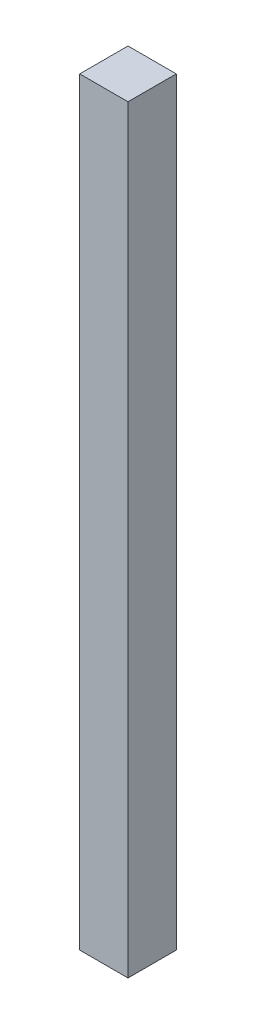
ISO-10303-21;
HEADER;
FILE_DESCRIPTION(('STEP AP214'),'2;1');
FILE_NAME('part.step','',(''),(''),'','','');
FILE_SCHEMA(('AUTOMOTIVE_DESIGN { 1 0 10303 214 1 1 1 1 }'));
ENDSEC;
DATA;
#1=APPLICATION_CONTEXT('core data for automotive mechanical design processes');
#2=APPLICATION_PROTOCOL_DEFINITION('international standard','automotive_design',2000,#1);
#3=PRODUCT_CONTEXT('',#1,'mechanical');
#4=PRODUCT('Part','Part','',(#3));
#5=PRODUCT_RELATED_PRODUCT_CATEGORY('part','',(#4));
#6=PRODUCT_DEFINITION_FORMATION('','',#4);
#7=PRODUCT_DEFINITION_CONTEXT('part definition',#1,'design');
#8=PRODUCT_DEFINITION('design','',#6,#7);
#9=PRODUCT_DEFINITION_SHAPE('','',#8);
#10=(LENGTH_UNIT() NAMED_UNIT(*) SI_UNIT(.MILLI.,.METRE.));
#11=(NAMED_UNIT(*) PLANE_ANGLE_UNIT() SI_UNIT($,.RADIAN.));
#12=(NAMED_UNIT(*) SI_UNIT($,.STERADIAN.) SOLID_ANGLE_UNIT());
#13=UNCERTAINTY_MEASURE_WITH_UNIT(LENGTH_MEASURE(1.E-05),#10,'distance_accuracy_value','');
#14=(GEOMETRIC_REPRESENTATION_CONTEXT(3) GLOBAL_UNCERTAINTY_ASSIGNED_CONTEXT((#13)) GLOBAL_UNIT_ASSIGNED_CONTEXT((#10,
#11,#12)) REPRESENTATION_CONTEXT('',''));
#15=CARTESIAN_POINT('',(0.,0.,0.));
#16=DIRECTION('',(0.,0.,1.));
#17=DIRECTION('',(1.,0.,0.));
#18=AXIS2_PLACEMENT_3D('',#15,#16,#17);
#19=CARTESIAN_POINT('',(0.,399.2,0.));
#20=DIRECTION('',(1.,0.,0.));
#21=DIRECTION('',(0.,0.,-1.));
#22=AXIS2_PLACEMENT_3D('',#19,#20,#21);
#23=PLANE('',#22);
#24=DIRECTION('',(0.,0.,1.));
#25=VECTOR('',#24,1.);
#26=CARTESIAN_POINT('',(0.,0.,0.));
#27=LINE('',#26,#25);
#28=CARTESIAN_POINT('',(0.,0.,-25.4));
#29=VERTEX_POINT('',#28);
#30=CARTESIAN_POINT('',(0.,0.,0.));
#31=VERTEX_POINT('',#30);
#32=EDGE_CURVE('E111',#29,#31,#27,.T.);
#33=ORIENTED_EDGE('',*,*,#32,.T.);
#34=DIRECTION('',(0.,-1.,0.));
#35=VECTOR('',#34,1.);
#36=CARTESIAN_POINT('',(0.,399.2,0.));
#37=LINE('',#36,#35);
#38=CARTESIAN_POINT('',(0.,399.2,0.));
#39=VERTEX_POINT('',#38);
#40=EDGE_CURVE('E11',#39,#31,#37,.T.);
#41=ORIENTED_EDGE('',*,*,#40,.F.);
#42=DIRECTION('',(0.,0.,1.));
#43=VECTOR('',#42,1.);
#44=CARTESIAN_POINT('',(0.,399.2,0.));
#45=LINE('',#44,#43);
#46=CARTESIAN_POINT('',(0.,399.2,-25.4));
#47=VERTEX_POINT('',#46);
#48=EDGE_CURVE('E95',#47,#39,#45,.T.);
#49=ORIENTED_EDGE('',*,*,#48,.F.);
#50=DIRECTION('',(0.,-1.,0.));
#51=VECTOR('',#50,1.);
#52=CARTESIAN_POINT('',(0.,399.2,-25.4));
#53=LINE('',#52,#51);
#54=EDGE_CURVE('E107',#47,#29,#53,.T.);
#55=ORIENTED_EDGE('',*,*,#54,.T.);
#56=EDGE_LOOP('',(#33,#41,#49,#55));
#57=FACE_BOUND('',#56,.T.);
#58=ADVANCED_FACE('F43',(#57),#23,.F.);
#59=CARTESIAN_POINT('',(0.,399.2,0.));
#60=DIRECTION('',(0.,0.,-1.));
#61=DIRECTION('',(-1.,0.,0.));
#62=AXIS2_PLACEMENT_3D('',#59,#60,#61);
#63=PLANE('',#62);
#64=DIRECTION('',(1.,0.,0.));
#65=VECTOR('',#64,1.);
#66=CARTESIAN_POINT('',(0.,0.,0.));
#67=LINE('',#66,#65);
#68=CARTESIAN_POINT('',(25.4,0.,0.));
#69=VERTEX_POINT('',#68);
#70=EDGE_CURVE('E100',#31,#69,#67,.T.);
#71=ORIENTED_EDGE('',*,*,#70,.T.);
#72=DIRECTION('',(0.,-1.,0.));
#73=VECTOR('',#72,1.);
#74=CARTESIAN_POINT('',(25.4,399.2,0.));
#75=LINE('',#74,#73);
#76=CARTESIAN_POINT('',(25.4,399.2,0.));
#77=VERTEX_POINT('',#76);
#78=EDGE_CURVE('E52',#77,#69,#75,.T.);
#79=ORIENTED_EDGE('',*,*,#78,.F.);
#80=DIRECTION('',(1.,0.,0.));
#81=VECTOR('',#80,1.);
#82=CARTESIAN_POINT('',(0.,399.2,0.));
#83=LINE('',#82,#81);
#84=EDGE_CURVE('E90',#39,#77,#83,.T.);
#85=ORIENTED_EDGE('',*,*,#84,.F.);
#86=ORIENTED_EDGE('',*,*,#40,.T.);
#87=EDGE_LOOP('',(#71,#79,#85,#86));
#88=FACE_BOUND('',#87,.T.);
#89=ADVANCED_FACE('F99',(#88),#63,.F.);
#90=CARTESIAN_POINT('',(25.4,399.2,0.));
#91=DIRECTION('',(-1.,0.,0.));
#92=DIRECTION('',(0.,0.,1.));
#93=AXIS2_PLACEMENT_3D('',#90,#91,#92);
#94=PLANE('',#93);
#95=DIRECTION('',(0.,0.,-1.));
#96=VECTOR('',#95,1.);
#97=CARTESIAN_POINT('',(25.4,0.,0.));
#98=LINE('',#97,#96);
#99=CARTESIAN_POINT('',(25.4,0.,-25.4));
#100=VERTEX_POINT('',#99);
#101=EDGE_CURVE('E77',#69,#100,#98,.T.);
#102=ORIENTED_EDGE('',*,*,#101,.T.);
#103=DIRECTION('',(0.,-1.,0.));
#104=VECTOR('',#103,1.);
#105=CARTESIAN_POINT('',(25.4,399.2,-25.4));
#106=LINE('',#105,#104);
#107=CARTESIAN_POINT('',(25.4,399.2,-25.4));
#108=VERTEX_POINT('',#107);
#109=EDGE_CURVE('E102',#108,#100,#106,.T.);
#110=ORIENTED_EDGE('',*,*,#109,.F.);
#111=DIRECTION('',(0.,0.,-1.));
#112=VECTOR('',#111,1.);
#113=CARTESIAN_POINT('',(25.4,399.2,0.));
#114=LINE('',#113,#112);
#115=EDGE_CURVE('E93',#77,#108,#114,.T.);
#116=ORIENTED_EDGE('',*,*,#115,.F.);
#117=ORIENTED_EDGE('',*,*,#78,.T.);
#118=EDGE_LOOP('',(#102,#110,#116,#117));
#119=FACE_BOUND('',#118,.T.);
#120=ADVANCED_FACE('F103',(#119),#94,.F.);
#121=CARTESIAN_POINT('',(0.,399.2,-25.4));
#122=DIRECTION('',(0.,0.,1.));
#123=DIRECTION('',(1.,0.,0.));
#124=AXIS2_PLACEMENT_3D('',#121,#122,#123);
#125=PLANE('',#124);
#126=DIRECTION('',(-1.,0.,0.));
#127=VECTOR('',#126,1.);
#128=CARTESIAN_POINT('',(0.,0.,-25.4));
#129=LINE('',#128,#127);
#130=EDGE_CURVE('E83',#100,#29,#129,.T.);
#131=ORIENTED_EDGE('',*,*,#130,.T.);
#132=ORIENTED_EDGE('',*,*,#54,.F.);
#133=DIRECTION('',(-1.,0.,0.));
#134=VECTOR('',#133,1.);
#135=CARTESIAN_POINT('',(0.,399.2,-25.4));
#136=LINE('',#135,#134);
#137=EDGE_CURVE('E60',#108,#47,#136,.T.);
#138=ORIENTED_EDGE('',*,*,#137,.F.);
#139=ORIENTED_EDGE('',*,*,#109,.T.);
#140=EDGE_LOOP('',(#131,#132,#138,#139));
#141=FACE_BOUND('',#140,.T.);
#142=ADVANCED_FACE('F124',(#141),#125,.F.);
#143=CARTESIAN_POINT('',(0.,399.2,0.));
#144=DIRECTION('',(0.,-1.,0.));
#145=DIRECTION('',(0.,0.,-1.));
#146=AXIS2_PLACEMENT_3D('',#143,#144,#145);
#147=PLANE('',#146);
#148=ORIENTED_EDGE('',*,*,#48,.T.);
#149=ORIENTED_EDGE('',*,*,#84,.T.);
#150=ORIENTED_EDGE('',*,*,#115,.T.);
#151=ORIENTED_EDGE('',*,*,#137,.T.);
#152=EDGE_LOOP('',(#148,#149,#150,#151));
#153=FACE_BOUND('',#152,.T.);
#154=ADVANCED_FACE('F91',(#153),#147,.F.);
#155=CARTESIAN_POINT('',(0.,0.,0.));
#156=DIRECTION('',(0.,-1.,0.));
#157=DIRECTION('',(0.,0.,-1.));
#158=AXIS2_PLACEMENT_3D('',#155,#156,#157);
#159=PLANE('',#158);
#160=ORIENTED_EDGE('',*,*,#32,.F.);
#161=ORIENTED_EDGE('',*,*,#130,.F.);
#162=ORIENTED_EDGE('',*,*,#101,.F.);
#163=ORIENTED_EDGE('',*,*,#70,.F.);
#164=EDGE_LOOP('',(#160,#161,#162,#163));
#165=FACE_BOUND('',#164,.T.);
#166=ADVANCED_FACE('F127',(#165),#159,.T.);
#167=CLOSED_SHELL('',(#58,#89,#120,#142,#154,#166));
#168=MANIFOLD_SOLID_BREP('B2',#167);
#169=ADVANCED_BREP_SHAPE_REPRESENTATION('',(#18,#168),#14);
#170=SHAPE_DEFINITION_REPRESENTATION(#9,#169);
ENDSEC;
END-ISO-10303-21;
